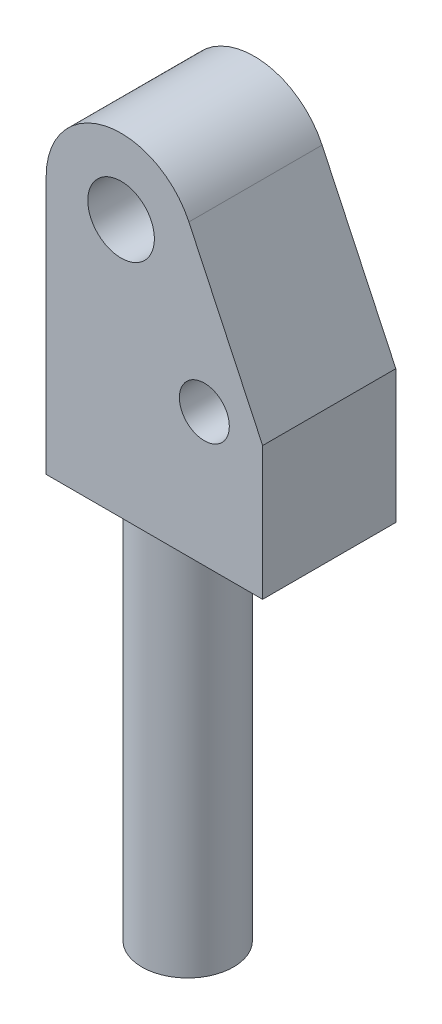
ISO-10303-21;
HEADER;
FILE_DESCRIPTION(('STEP AP214'),'2;1');
FILE_NAME('part.step','',(''),(''),'','','');
FILE_SCHEMA(('AUTOMOTIVE_DESIGN { 1 0 10303 214 1 1 1 1 }'));
ENDSEC;
DATA;
#1=APPLICATION_CONTEXT('core data for automotive mechanical design processes');
#2=APPLICATION_PROTOCOL_DEFINITION('international standard','automotive_design',2000,#1);
#3=PRODUCT_CONTEXT('',#1,'mechanical');
#4=PRODUCT('Part','Part','',(#3));
#5=PRODUCT_RELATED_PRODUCT_CATEGORY('part','',(#4));
#6=PRODUCT_DEFINITION_FORMATION('','',#4);
#7=PRODUCT_DEFINITION_CONTEXT('part definition',#1,'design');
#8=PRODUCT_DEFINITION('design','',#6,#7);
#9=PRODUCT_DEFINITION_SHAPE('','',#8);
#10=(LENGTH_UNIT() NAMED_UNIT(*) SI_UNIT(.MILLI.,.METRE.));
#11=(NAMED_UNIT(*) PLANE_ANGLE_UNIT() SI_UNIT($,.RADIAN.));
#12=(NAMED_UNIT(*) SI_UNIT($,.STERADIAN.) SOLID_ANGLE_UNIT());
#13=UNCERTAINTY_MEASURE_WITH_UNIT(LENGTH_MEASURE(1.E-05),#10,'distance_accuracy_value','');
#14=(GEOMETRIC_REPRESENTATION_CONTEXT(3) GLOBAL_UNCERTAINTY_ASSIGNED_CONTEXT((#13)) GLOBAL_UNIT_ASSIGNED_CONTEXT((#10,
#11,#12)) REPRESENTATION_CONTEXT('',''));
#15=CARTESIAN_POINT('',(0.,0.,0.));
#16=DIRECTION('',(0.,0.,1.));
#17=DIRECTION('',(1.,0.,0.));
#18=AXIS2_PLACEMENT_3D('',#15,#16,#17);
#19=CARTESIAN_POINT('',(0.,48.,0.));
#20=DIRECTION('',(0.,-1.,0.));
#21=DIRECTION('',(0.,0.,-1.));
#22=AXIS2_PLACEMENT_3D('',#19,#20,#21);
#23=CYLINDRICAL_SURFACE('',#22,5.5);
#24=CARTESIAN_POINT('',(0.,47.,0.));
#25=DIRECTION('',(0.,1.,0.));
#26=DIRECTION('',(0.,0.,1.));
#27=AXIS2_PLACEMENT_3D('',#24,#25,#26);
#28=CIRCLE('',#27,5.5);
#29=CARTESIAN_POINT('',(0.,47.,5.5));
#30=VERTEX_POINT('',#29);
#31=EDGE_CURVE('E11',#30,#30,#28,.F.);
#32=ORIENTED_EDGE('',*,*,#31,.T.);
#33=EDGE_LOOP('',(#32));
#34=FACE_BOUND('',#33,.T.);
#35=CARTESIAN_POINT('',(0.,0.,0.));
#36=DIRECTION('',(0.,1.,0.));
#37=DIRECTION('',(0.,0.,1.));
#38=AXIS2_PLACEMENT_3D('',#35,#36,#37);
#39=CIRCLE('',#38,5.5);
#40=CARTESIAN_POINT('',(0.,0.,5.5));
#41=VERTEX_POINT('',#40);
#42=EDGE_CURVE('E133',#41,#41,#39,.T.);
#43=ORIENTED_EDGE('',*,*,#42,.T.);
#44=EDGE_LOOP('',(#43));
#45=FACE_BOUND('',#44,.T.);
#46=ADVANCED_FACE('F41',(#34,#45),#23,.T.);
#47=CARTESIAN_POINT('',(0.,0.,0.));
#48=DIRECTION('',(0.,1.,0.));
#49=DIRECTION('',(0.,0.,1.));
#50=AXIS2_PLACEMENT_3D('',#47,#48,#49);
#51=PLANE('',#50);
#52=ORIENTED_EDGE('',*,*,#42,.F.);
#53=EDGE_LOOP('',(#52));
#54=FACE_BOUND('',#53,.T.);
#55=ADVANCED_FACE('F153',(#54),#51,.F.);
#56=CARTESIAN_POINT('',(0.,79.,8.));
#57=DIRECTION('',(0.,0.,1.));
#58=DIRECTION('',(1.,0.,0.));
#59=AXIS2_PLACEMENT_3D('',#56,#57,#58);
#60=PLANE('',#59);
#61=CARTESIAN_POINT('',(0.,79.,8.));
#62=DIRECTION('',(0.,0.,1.));
#63=DIRECTION('',(1.,0.,0.));
#64=AXIS2_PLACEMENT_3D('',#61,#62,#63);
#65=CIRCLE('',#64,4.);
#66=CARTESIAN_POINT('',(4.,79.,8.));
#67=VERTEX_POINT('',#66);
#68=EDGE_CURVE('E124',#67,#67,#65,.T.);
#69=ORIENTED_EDGE('',*,*,#68,.F.);
#70=EDGE_LOOP('',(#69));
#71=FACE_BOUND('',#70,.T.);
#72=CARTESIAN_POINT('',(0.,79.,8.));
#73=DIRECTION('',(0.,0.,1.));
#74=DIRECTION('',(1.,0.,0.));
#75=AXIS2_PLACEMENT_3D('',#72,#73,#74);
#76=CIRCLE('',#75,9.);
#77=CARTESIAN_POINT('',(8.14429577101644,82.8302018738186,8.));
#78=VERTEX_POINT('',#77);
#79=CARTESIAN_POINT('',(-9.,79.,8.));
#80=VERTEX_POINT('',#79);
#81=EDGE_CURVE('E129',#78,#80,#76,.T.);
#82=ORIENTED_EDGE('',*,*,#81,.T.);
#83=DIRECTION('',(0.,-1.,0.));
#84=VECTOR('',#83,1.);
#85=CARTESIAN_POINT('',(-9.,79.,8.));
#86=LINE('',#85,#84);
#87=CARTESIAN_POINT('',(-9.,48.,8.));
#88=VERTEX_POINT('',#87);
#89=EDGE_CURVE('E94',#80,#88,#86,.T.);
#90=ORIENTED_EDGE('',*,*,#89,.T.);
#91=DIRECTION('',(1.,0.,0.));
#92=VECTOR('',#91,1.);
#93=CARTESIAN_POINT('',(-9.,48.,8.));
#94=LINE('',#93,#92);
#95=CARTESIAN_POINT('',(17.,48.,8.));
#96=VERTEX_POINT('',#95);
#97=EDGE_CURVE('E98',#88,#96,#94,.T.);
#98=ORIENTED_EDGE('',*,*,#97,.T.);
#99=DIRECTION('',(0.,1.,0.));
#100=VECTOR('',#99,1.);
#101=CARTESIAN_POINT('',(17.,48.,8.));
#102=LINE('',#101,#100);
#103=CARTESIAN_POINT('',(17.,64.,8.));
#104=VERTEX_POINT('',#103);
#105=EDGE_CURVE('E103',#96,#104,#102,.T.);
#106=ORIENTED_EDGE('',*,*,#105,.T.);
#107=DIRECTION('',(-0.425577985979848,0.90492175233516,0.));
#108=VECTOR('',#107,1.);
#109=CARTESIAN_POINT('',(17.,64.,8.));
#110=LINE('',#109,#108);
#111=EDGE_CURVE('E56',#104,#78,#110,.T.);
#112=ORIENTED_EDGE('',*,*,#111,.T.);
#113=EDGE_LOOP('',(#82,#90,#98,#106,#112));
#114=FACE_BOUND('',#113,.T.);
#115=CARTESIAN_POINT('',(10.,64.,8.));
#116=DIRECTION('',(0.,0.,1.));
#117=DIRECTION('',(1.,0.,0.));
#118=AXIS2_PLACEMENT_3D('',#115,#116,#117);
#119=CIRCLE('',#118,3.);
#120=CARTESIAN_POINT('',(13.,64.,8.));
#121=VERTEX_POINT('',#120);
#122=EDGE_CURVE('E191',#121,#121,#119,.T.);
#123=ORIENTED_EDGE('',*,*,#122,.F.);
#124=EDGE_LOOP('',(#123));
#125=FACE_BOUND('',#124,.T.);
#126=ADVANCED_FACE('F99',(#71,#114,#125),#60,.T.);
#127=CARTESIAN_POINT('',(0.,79.,-8.));
#128=DIRECTION('',(0.,0.,1.));
#129=DIRECTION('',(1.,0.,0.));
#130=AXIS2_PLACEMENT_3D('',#127,#128,#129);
#131=PLANE('',#130);
#132=CARTESIAN_POINT('',(0.,79.,-8.));
#133=DIRECTION('',(0.,0.,1.));
#134=DIRECTION('',(1.,0.,0.));
#135=AXIS2_PLACEMENT_3D('',#132,#133,#134);
#136=CIRCLE('',#135,9.);
#137=CARTESIAN_POINT('',(8.14429577101644,82.8302018738186,-8.));
#138=VERTEX_POINT('',#137);
#139=CARTESIAN_POINT('',(-9.,79.,-8.));
#140=VERTEX_POINT('',#139);
#141=EDGE_CURVE('E118',#138,#140,#136,.T.);
#142=ORIENTED_EDGE('',*,*,#141,.F.);
#143=DIRECTION('',(-0.425577985979848,0.90492175233516,0.));
#144=VECTOR('',#143,1.);
#145=CARTESIAN_POINT('',(17.,64.,-8.));
#146=LINE('',#145,#144);
#147=CARTESIAN_POINT('',(17.,64.,-8.));
#148=VERTEX_POINT('',#147);
#149=EDGE_CURVE('E82',#148,#138,#146,.T.);
#150=ORIENTED_EDGE('',*,*,#149,.F.);
#151=DIRECTION('',(0.,1.,0.));
#152=VECTOR('',#151,1.);
#153=CARTESIAN_POINT('',(17.,48.,-8.));
#154=LINE('',#153,#152);
#155=CARTESIAN_POINT('',(17.,48.,-8.));
#156=VERTEX_POINT('',#155);
#157=EDGE_CURVE('E76',#156,#148,#154,.T.);
#158=ORIENTED_EDGE('',*,*,#157,.F.);
#159=DIRECTION('',(1.,0.,0.));
#160=VECTOR('',#159,1.);
#161=CARTESIAN_POINT('',(-9.,48.,-8.));
#162=LINE('',#161,#160);
#163=CARTESIAN_POINT('',(-9.,48.,-8.));
#164=VERTEX_POINT('',#163);
#165=EDGE_CURVE('E109',#164,#156,#162,.T.);
#166=ORIENTED_EDGE('',*,*,#165,.F.);
#167=DIRECTION('',(0.,-1.,0.));
#168=VECTOR('',#167,1.);
#169=CARTESIAN_POINT('',(-9.,79.,-8.));
#170=LINE('',#169,#168);
#171=EDGE_CURVE('E121',#140,#164,#170,.T.);
#172=ORIENTED_EDGE('',*,*,#171,.F.);
#173=EDGE_LOOP('',(#142,#150,#158,#166,#172));
#174=FACE_BOUND('',#173,.T.);
#175=CARTESIAN_POINT('',(0.,79.,-8.));
#176=DIRECTION('',(0.,0.,1.));
#177=DIRECTION('',(1.,0.,0.));
#178=AXIS2_PLACEMENT_3D('',#175,#176,#177);
#179=CIRCLE('',#178,4.);
#180=CARTESIAN_POINT('',(4.,79.,-8.));
#181=VERTEX_POINT('',#180);
#182=EDGE_CURVE('E193',#181,#181,#179,.T.);
#183=ORIENTED_EDGE('',*,*,#182,.T.);
#184=EDGE_LOOP('',(#183));
#185=FACE_BOUND('',#184,.T.);
#186=CARTESIAN_POINT('',(10.,64.,-8.));
#187=DIRECTION('',(0.,0.,1.));
#188=DIRECTION('',(1.,0.,0.));
#189=AXIS2_PLACEMENT_3D('',#186,#187,#188);
#190=CIRCLE('',#189,3.);
#191=CARTESIAN_POINT('',(13.,64.,-8.));
#192=VERTEX_POINT('',#191);
#193=EDGE_CURVE('E197',#192,#192,#190,.T.);
#194=ORIENTED_EDGE('',*,*,#193,.T.);
#195=EDGE_LOOP('',(#194));
#196=FACE_BOUND('',#195,.T.);
#197=ADVANCED_FACE('F167',(#174,#185,#196),#131,.F.);
#198=CARTESIAN_POINT('',(0.,79.,8.));
#199=DIRECTION('',(0.,0.,-1.));
#200=DIRECTION('',(-1.,0.,0.));
#201=AXIS2_PLACEMENT_3D('',#198,#199,#200);
#202=CYLINDRICAL_SURFACE('',#201,9.);
#203=ORIENTED_EDGE('',*,*,#141,.T.);
#204=DIRECTION('',(0.,0.,-1.));
#205=VECTOR('',#204,1.);
#206=CARTESIAN_POINT('',(-9.,79.,8.));
#207=LINE('',#206,#205);
#208=EDGE_CURVE('E134',#80,#140,#207,.T.);
#209=ORIENTED_EDGE('',*,*,#208,.F.);
#210=ORIENTED_EDGE('',*,*,#81,.F.);
#211=DIRECTION('',(0.,0.,-1.));
#212=VECTOR('',#211,1.);
#213=CARTESIAN_POINT('',(8.14429577101644,82.8302018738186,8.));
#214=LINE('',#213,#212);
#215=EDGE_CURVE('E117',#78,#138,#214,.T.);
#216=ORIENTED_EDGE('',*,*,#215,.T.);
#217=EDGE_LOOP('',(#203,#209,#210,#216));
#218=FACE_BOUND('',#217,.T.);
#219=ADVANCED_FACE('F165',(#218),#202,.T.);
#220=CARTESIAN_POINT('',(-9.,79.,8.));
#221=DIRECTION('',(1.,0.,0.));
#222=DIRECTION('',(0.,1.,0.));
#223=AXIS2_PLACEMENT_3D('',#220,#221,#222);
#224=PLANE('',#223);
#225=ORIENTED_EDGE('',*,*,#171,.T.);
#226=DIRECTION('',(0.,0.,-1.));
#227=VECTOR('',#226,1.);
#228=CARTESIAN_POINT('',(-9.,48.,8.));
#229=LINE('',#228,#227);
#230=EDGE_CURVE('E112',#88,#164,#229,.T.);
#231=ORIENTED_EDGE('',*,*,#230,.F.);
#232=ORIENTED_EDGE('',*,*,#89,.F.);
#233=ORIENTED_EDGE('',*,*,#208,.T.);
#234=EDGE_LOOP('',(#225,#231,#232,#233));
#235=FACE_BOUND('',#234,.T.);
#236=ADVANCED_FACE('F164',(#235),#224,.F.);
#237=CARTESIAN_POINT('',(-9.,48.,8.));
#238=DIRECTION('',(0.,1.,0.));
#239=DIRECTION('',(0.,0.,1.));
#240=AXIS2_PLACEMENT_3D('',#237,#238,#239);
#241=PLANE('',#240);
#242=CARTESIAN_POINT('',(0.,48.,0.));
#243=DIRECTION('',(0.,1.,0.));
#244=DIRECTION('',(0.,0.,1.));
#245=AXIS2_PLACEMENT_3D('',#242,#243,#244);
#246=CIRCLE('',#245,6.50000000000001);
#247=CARTESIAN_POINT('',(0.,48.,6.50000000000001));
#248=VERTEX_POINT('',#247);
#249=EDGE_CURVE('E51',#248,#248,#246,.T.);
#250=ORIENTED_EDGE('',*,*,#249,.T.);
#251=EDGE_LOOP('',(#250));
#252=FACE_BOUND('',#251,.T.);
#253=ORIENTED_EDGE('',*,*,#165,.T.);
#254=DIRECTION('',(0.,0.,-1.));
#255=VECTOR('',#254,1.);
#256=CARTESIAN_POINT('',(17.,48.,8.));
#257=LINE('',#256,#255);
#258=EDGE_CURVE('E110',#96,#156,#257,.T.);
#259=ORIENTED_EDGE('',*,*,#258,.F.);
#260=ORIENTED_EDGE('',*,*,#97,.F.);
#261=ORIENTED_EDGE('',*,*,#230,.T.);
#262=EDGE_LOOP('',(#253,#259,#260,#261));
#263=FACE_BOUND('',#262,.T.);
#264=ADVANCED_FACE('F107',(#252,#263),#241,.F.);
#265=CARTESIAN_POINT('',(17.,48.,8.));
#266=DIRECTION('',(-1.,0.,0.));
#267=DIRECTION('',(0.,0.,1.));
#268=AXIS2_PLACEMENT_3D('',#265,#266,#267);
#269=PLANE('',#268);
#270=ORIENTED_EDGE('',*,*,#157,.T.);
#271=DIRECTION('',(0.,0.,-1.));
#272=VECTOR('',#271,1.);
#273=CARTESIAN_POINT('',(17.,64.,8.));
#274=LINE('',#273,#272);
#275=EDGE_CURVE('E115',#104,#148,#274,.T.);
#276=ORIENTED_EDGE('',*,*,#275,.F.);
#277=ORIENTED_EDGE('',*,*,#105,.F.);
#278=ORIENTED_EDGE('',*,*,#258,.T.);
#279=EDGE_LOOP('',(#270,#276,#277,#278));
#280=FACE_BOUND('',#279,.T.);
#281=ADVANCED_FACE('F111',(#280),#269,.F.);
#282=CARTESIAN_POINT('',(17.,64.,8.));
#283=DIRECTION('',(-0.90492175233516,-0.425577985979848,0.));
#284=DIRECTION('',(0.425577985979848,-0.90492175233516,0.));
#285=AXIS2_PLACEMENT_3D('',#282,#283,#284);
#286=PLANE('',#285);
#287=ORIENTED_EDGE('',*,*,#149,.T.);
#288=ORIENTED_EDGE('',*,*,#215,.F.);
#289=ORIENTED_EDGE('',*,*,#111,.F.);
#290=ORIENTED_EDGE('',*,*,#275,.T.);
#291=EDGE_LOOP('',(#287,#288,#289,#290));
#292=FACE_BOUND('',#291,.T.);
#293=ADVANCED_FACE('F174',(#292),#286,.F.);
#294=CARTESIAN_POINT('',(0.,79.,8.));
#295=DIRECTION('',(0.,0.,-1.));
#296=DIRECTION('',(-1.,0.,0.));
#297=AXIS2_PLACEMENT_3D('',#294,#295,#296);
#298=CYLINDRICAL_SURFACE('',#297,4.);
#299=ORIENTED_EDGE('',*,*,#68,.T.);
#300=EDGE_LOOP('',(#299));
#301=FACE_BOUND('',#300,.T.);
#302=ORIENTED_EDGE('',*,*,#182,.F.);
#303=EDGE_LOOP('',(#302));
#304=FACE_BOUND('',#303,.T.);
#305=ADVANCED_FACE('F146',(#301,#304),#298,.F.);
#306=CARTESIAN_POINT('',(10.,64.,8.));
#307=DIRECTION('',(0.,0.,-1.));
#308=DIRECTION('',(-1.,0.,0.));
#309=AXIS2_PLACEMENT_3D('',#306,#307,#308);
#310=CYLINDRICAL_SURFACE('',#309,3.);
#311=ORIENTED_EDGE('',*,*,#122,.T.);
#312=EDGE_LOOP('',(#311));
#313=FACE_BOUND('',#312,.T.);
#314=ORIENTED_EDGE('',*,*,#193,.F.);
#315=EDGE_LOOP('',(#314));
#316=FACE_BOUND('',#315,.T.);
#317=ADVANCED_FACE('F142',(#313,#316),#310,.F.);
#318=CARTESIAN_POINT('',(0.,48.,0.));
#319=DIRECTION('',(0.,1.,0.));
#320=DIRECTION('',(0.,0.,1.));
#321=AXIS2_PLACEMENT_3D('',#318,#319,#320);
#322=CONICAL_SURFACE('',#321,6.50000000000001,0.785398163397454);
#323=ORIENTED_EDGE('',*,*,#31,.F.);
#324=EDGE_LOOP('',(#323));
#325=FACE_BOUND('',#324,.T.);
#326=ORIENTED_EDGE('',*,*,#249,.F.);
#327=EDGE_LOOP('',(#326));
#328=FACE_BOUND('',#327,.T.);
#329=ADVANCED_FACE('F42',(#325,#328),#322,.T.);
#330=CLOSED_SHELL('',(#46,#55,#126,#197,#219,#236,#264,#281,#293,#305,#317,#329));
#331=MANIFOLD_SOLID_BREP('B2',#330);
#332=ADVANCED_BREP_SHAPE_REPRESENTATION('',(#18,#331),#14);
#333=SHAPE_DEFINITION_REPRESENTATION(#9,#332);
ENDSEC;
END-ISO-10303-21;
